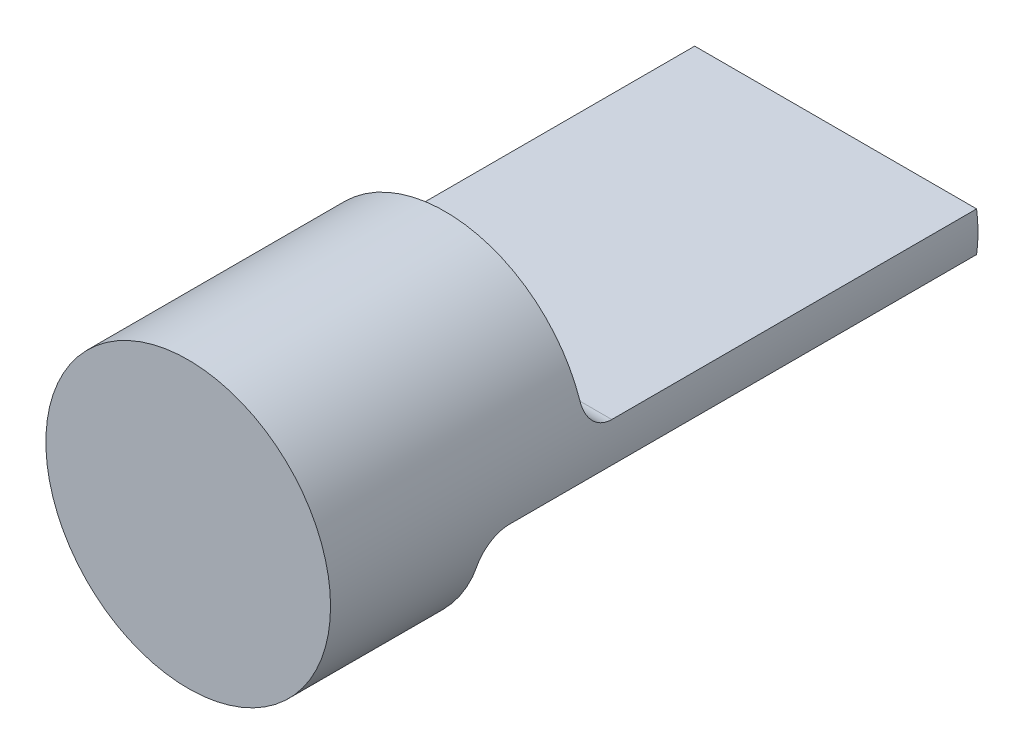
ISO-10303-21;
HEADER;
FILE_DESCRIPTION(('STEP AP214'),'2;1');
FILE_NAME('part.step','',(''),(''),'','','');
FILE_SCHEMA(('AUTOMOTIVE_DESIGN { 1 0 10303 214 1 1 1 1 }'));
ENDSEC;
DATA;
#1=APPLICATION_CONTEXT('core data for automotive mechanical design processes');
#2=APPLICATION_PROTOCOL_DEFINITION('international standard','automotive_design',2000,#1);
#3=PRODUCT_CONTEXT('',#1,'mechanical');
#4=PRODUCT('Part','Part','',(#3));
#5=PRODUCT_RELATED_PRODUCT_CATEGORY('part','',(#4));
#6=PRODUCT_DEFINITION_FORMATION('','',#4);
#7=PRODUCT_DEFINITION_CONTEXT('part definition',#1,'design');
#8=PRODUCT_DEFINITION('design','',#6,#7);
#9=PRODUCT_DEFINITION_SHAPE('','',#8);
#10=(LENGTH_UNIT() NAMED_UNIT(*) SI_UNIT(.MILLI.,.METRE.));
#11=(NAMED_UNIT(*) PLANE_ANGLE_UNIT() SI_UNIT($,.RADIAN.));
#12=(NAMED_UNIT(*) SI_UNIT($,.STERADIAN.) SOLID_ANGLE_UNIT());
#13=UNCERTAINTY_MEASURE_WITH_UNIT(LENGTH_MEASURE(1.E-05),#10,'distance_accuracy_value','');
#14=(GEOMETRIC_REPRESENTATION_CONTEXT(3) GLOBAL_UNCERTAINTY_ASSIGNED_CONTEXT((#13)) GLOBAL_UNIT_ASSIGNED_CONTEXT((#10,
#11,#12)) REPRESENTATION_CONTEXT('',''));
#15=CARTESIAN_POINT('',(0.,0.,0.));
#16=DIRECTION('',(0.,0.,1.));
#17=DIRECTION('',(1.,0.,0.));
#18=AXIS2_PLACEMENT_3D('',#15,#16,#17);
#19=CARTESIAN_POINT('',(0.,0.,63.));
#20=DIRECTION('',(0.,0.,-1.));
#21=DIRECTION('',(-1.,0.,0.));
#22=AXIS2_PLACEMENT_3D('',#19,#20,#21);
#23=CYLINDRICAL_SURFACE('',#22,13.85);
#24=CARTESIAN_POINT('',(0.,0.,63.));
#25=DIRECTION('',(0.,0.,1.));
#26=DIRECTION('',(1.,0.,0.));
#27=AXIS2_PLACEMENT_3D('',#24,#25,#26);
#28=CIRCLE('',#27,13.85);
#29=CARTESIAN_POINT('',(13.85,0.,63.));
#30=VERTEX_POINT('',#29);
#31=EDGE_CURVE('E126',#30,#30,#28,.T.);
#32=ORIENTED_EDGE('',*,*,#31,.F.);
#33=EDGE_LOOP('',(#32));
#34=FACE_BOUND('',#33,.T.);
#35=CARTESIAN_POINT('',(0.,0.,0.));
#36=DIRECTION('',(0.,0.,1.));
#37=DIRECTION('',(1.,0.,0.));
#38=AXIS2_PLACEMENT_3D('',#35,#36,#37);
#39=CIRCLE('',#38,13.85);
#40=CARTESIAN_POINT('',(13.7155705313341,-1.925,0.));
#41=VERTEX_POINT('',#40);
#42=CARTESIAN_POINT('',(13.7155705313341,1.925,0.));
#43=VERTEX_POINT('',#42);
#44=EDGE_CURVE('E125',#41,#43,#39,.T.);
#45=ORIENTED_EDGE('',*,*,#44,.T.);
#46=DIRECTION('',(0.,0.,-1.));
#47=VECTOR('',#46,1.);
#48=CARTESIAN_POINT('',(13.7155705313341,1.92499999999999,63.));
#49=LINE('',#48,#47);
#50=CARTESIAN_POINT('',(13.7155705313341,1.925,35.5));
#51=VERTEX_POINT('',#50);
#52=EDGE_CURVE('E62',#43,#51,#49,.F.);
#53=ORIENTED_EDGE('',*,*,#52,.T.);
#54=CARTESIAN_POINT('',(13.1240952069086,4.425,33.));
#55=CARTESIAN_POINT('',(13.1710729115553,4.285664156442,33.0000033032158));
#56=CARTESIAN_POINT('',(13.2158293360581,4.14552989343168,33.0116741758177));
#57=CARTESIAN_POINT('',(13.2998292439436,3.86757500273158,33.0588627106092));
#58=CARTESIAN_POINT('',(13.3390713291011,3.72975496961395,33.0943864078145));
#59=CARTESIAN_POINT('',(13.4114541945794,3.46047342005468,33.1891362792788));
#60=CARTESIAN_POINT('',(13.4445834953402,3.32902420216501,33.2484063997825));
#61=CARTESIAN_POINT('',(13.5044426577589,3.07722192265797,33.3894763389114));
#62=CARTESIAN_POINT('',(13.5311736489143,2.95686690488472,33.4712721755674));
#63=CARTESIAN_POINT('',(13.5776448323384,2.73540628678558,33.6520299428437));
#64=CARTESIAN_POINT('',(13.5975955312249,2.63377741145651,33.7502972203497));
#65=CARTESIAN_POINT('',(13.6322362885744,2.4481768476607,33.9630888236747));
#66=CARTESIAN_POINT('',(13.6469268359273,2.36420351854861,34.0776116372863));
#67=CARTESIAN_POINT('',(13.6714254158534,2.21811373917011,34.3172220824305));
#68=CARTESIAN_POINT('',(13.6813226789287,2.15560470297203,34.4420615201681));
#69=CARTESIAN_POINT('',(13.6972219139048,2.05216145062878,34.7006111216565));
#70=CARTESIAN_POINT('',(13.7032239816441,2.01122670366859,34.8343210670656));
#71=CARTESIAN_POINT('',(13.7117493874094,1.95226104461971,35.1064347973562));
#72=CARTESIAN_POINT('',(13.7142818248906,1.93417023182164,35.2448253252442));
#73=CARTESIAN_POINT('',(13.7160998313416,1.92123664939352,35.5227105317452));
#74=CARTESIAN_POINT('',(13.7153853864278,1.92639397917244,35.6622052150769));
#75=CARTESIAN_POINT('',(13.7106493418299,1.95981485166587,35.9384421341922));
#76=CARTESIAN_POINT('',(13.7066254051514,1.98809472225718,36.0751823549891));
#77=CARTESIAN_POINT('',(13.6949584801241,2.06692693062219,36.3419212582562));
#78=CARTESIAN_POINT('',(13.687315535298,2.11747900054688,36.4719200217793));
#79=CARTESIAN_POINT('',(13.6679155960134,2.23927779444663,36.72142571145));
#80=CARTESIAN_POINT('',(13.6561604555842,2.3105151897553,36.8409373355186));
#81=CARTESIAN_POINT('',(13.6279496469324,2.47146514725827,37.0661601897863));
#82=CARTESIAN_POINT('',(13.6114941549171,2.56117701684398,37.1718719371004));
#83=CARTESIAN_POINT('',(13.5733334764482,2.75626096010474,37.366631355932));
#84=CARTESIAN_POINT('',(13.5516267202655,2.86163771275222,37.4556740305185));
#85=CARTESIAN_POINT('',(13.5026028756308,3.08467719568579,37.614782072838));
#86=CARTESIAN_POINT('',(13.4752857488211,3.20234000996846,37.6848473108154));
#87=CARTESIAN_POINT('',(13.4146390422642,3.44761834831163,37.8051213934258));
#88=CARTESIAN_POINT('',(13.3812475051674,3.57532792315746,37.8551067921606));
#89=CARTESIAN_POINT('',(13.3089442370133,3.83572225675879,37.9333609606225));
#90=CARTESIAN_POINT('',(13.2700316919723,3.96840774700705,37.9616265241596));
#91=CARTESIAN_POINT('',(13.18588896636,4.23977630041225,37.9970118631079));
#92=CARTESIAN_POINT('',(13.1404848194382,4.37850626206434,38.0033535783124));
#93=CARTESIAN_POINT('',(13.045562795511,4.65370887718902,37.9933250838909));
#94=CARTESIAN_POINT('',(12.9960437747348,4.79018089031693,37.9769485395102));
#95=CARTESIAN_POINT('',(12.8913536288332,5.06541259775386,37.920892208483));
#96=CARTESIAN_POINT('',(12.8360212526374,5.20384762145553,37.8799186714713));
#97=CARTESIAN_POINT('',(12.7243116111879,5.47132843863055,37.7750498958281));
#98=CARTESIAN_POINT('',(12.6679339547631,5.60037062429042,37.7111459048519));
#99=CARTESIAN_POINT('',(12.5538891218842,5.85168939067569,37.558435702347));
#100=CARTESIAN_POINT('',(12.496281790263,5.97338233348139,37.4686198560147));
#101=CARTESIAN_POINT('',(12.3855341740798,6.19975343073754,37.2672560377124));
#102=CARTESIAN_POINT('',(12.3323945254696,6.3044291648488,37.1557049793185));
#103=CARTESIAN_POINT('',(12.2354217962344,6.4905857840395,36.9162444394477));
#104=CARTESIAN_POINT('',(12.1913829501092,6.57259820707086,36.7888347281016));
#105=CARTESIAN_POINT('',(12.1145667694054,6.71313881281902,36.5185961464812));
#106=CARTESIAN_POINT('',(12.0817763868004,6.7716942186016,36.3757853957419));
#107=CARTESIAN_POINT('',(12.0337429305439,6.85664975661643,36.0965410836403));
#108=CARTESIAN_POINT('',(12.016911168809,6.88598156924226,35.9612745032272));
#109=CARTESIAN_POINT('',(11.9962951775972,6.92183943602916,35.6868080132742));
#110=CARTESIAN_POINT('',(11.9925003886362,6.92838394715172,35.5476113791254));
#111=CARTESIAN_POINT('',(11.9980035659137,6.91884422581791,35.2852836697735));
#112=CARTESIAN_POINT('',(12.0059424021261,6.90510919602646,35.1620290903107));
#113=CARTESIAN_POINT('',(12.0318371835249,6.8598881760118,34.9199290625914));
#114=CARTESIAN_POINT('',(12.0497935424992,6.82840145252898,34.801083796684));
#115=CARTESIAN_POINT('',(12.0945255881311,6.74885355528383,34.5700943176525));
#116=CARTESIAN_POINT('',(12.1213521169147,6.7006967553563,34.4579932446777));
#117=CARTESIAN_POINT('',(12.1820784646159,6.58964793425681,34.2434552449521));
#118=CARTESIAN_POINT('',(12.215980449555,6.52675140005874,34.1410212915904));
#119=CARTESIAN_POINT('',(12.2928190920336,6.38095195693347,33.9374735603376));
#120=CARTESIAN_POINT('',(12.3363257271191,6.29665883839376,33.8375724367558));
#121=CARTESIAN_POINT('',(12.4275054100178,6.11473380784484,33.6529429224802));
#122=CARTESIAN_POINT('',(12.4751811799278,6.01709315722753,33.5682245565902));
#123=CARTESIAN_POINT('',(12.5783571259582,5.79859092470527,33.4062392386173));
#124=CARTESIAN_POINT('',(12.634120958907,5.67634919669665,33.3309969572025));
#125=CARTESIAN_POINT('',(12.7458005624646,5.42092900940774,33.2024897862467));
#126=CARTESIAN_POINT('',(12.8017162813143,5.28775391085973,33.1492181733987));
#127=CARTESIAN_POINT('',(12.9033849113065,5.0339827368016,33.0722417685126));
#128=CARTESIAN_POINT('',(12.9494117513381,4.91446460319946,33.0453164309181));
#129=CARTESIAN_POINT('',(13.0389078106179,4.67184054255879,33.0091952480748));
#130=CARTESIAN_POINT('',(13.0823773661491,4.54873509045078,32.9999970666291));
#131=CARTESIAN_POINT('',(13.1240952069086,4.425,33.));
#132=B_SPLINE_CURVE_WITH_KNOTS('',3,(#54,#55,#56,#57,#58,#59,#60,#61,#62,#63,#64,#65,#66,#67,
#68,#69,#70,#71,#72,#73,#74,#75,#76,#77,#78,#79,#80,#81,#82,#83,#84,#85,#86,#87,#88,#89,#90,#91,
#92,#93,#94,#95,#96,#97,#98,#99,#100,#101,#102,#103,#104,#105,#106,#107,#108,#109,#110,#111,
#112,#113,#114,#115,#116,#117,#118,#119,#120,#121,#122,#123,#124,#125,#126,#127,#128,#129,#130,
#131),.UNSPECIFIED.,.T.,.F.,(4,2,2,2,2,2,2,2,2,2,2,2,2,2,2,2,2,2,2,2,2,2,2,2,2,2,2,2,2,2,2,2,2,
2,2,2,2,2,4),(0.,0.440693399772733,0.881498341649641,1.32312285409781,1.76466934870905,
2.19088451376343,2.61706005516202,3.03496397145971,3.45285760514603,3.86965315908836,
4.28645049524864,4.70354240539619,5.120629299667,5.53752838748723,5.95441184859276,
6.37142008050834,6.78843116358655,7.20996205249228,7.63155515405194,8.06796475656859,
8.50449607190934,8.9662901834331,9.42826074537023,9.91146625491644,10.3947404302468,
10.8654703614668,11.3356523927869,11.751556408578,12.1671234773917,12.5381689734706,
12.909229797248,13.2824554468891,13.6557955207678,14.0674220102639,14.4793192932896,
14.9393049658758,15.3991497723038,15.7905524719736,16.1819035865864),.UNSPECIFIED.);
#133=CARTESIAN_POINT('',(13.1240952069086,4.425,38.));
#134=VERTEX_POINT('',#133);
#135=EDGE_CURVE('E11',#51,#134,#132,.T.);
#136=ORIENTED_EDGE('',*,*,#135,.T.);
#137=CARTESIAN_POINT('',(0.,0.,38.));
#138=DIRECTION('',(0.,0.,1.));
#139=DIRECTION('',(0.,-1.,0.));
#140=AXIS2_PLACEMENT_3D('',#137,#138,#139);
#141=CIRCLE('',#140,13.85);
#142=CARTESIAN_POINT('',(-13.1240952069086,4.425,38.));
#143=VERTEX_POINT('',#142);
#144=EDGE_CURVE('E151',#134,#143,#141,.T.);
#145=ORIENTED_EDGE('',*,*,#144,.T.);
#146=CARTESIAN_POINT('',(-13.1240952069086,4.425,33.));
#147=CARTESIAN_POINT('',(-13.0733479766338,4.57549812161907,33.0000062050174));
#148=CARTESIAN_POINT('',(-13.0199532867486,4.72522899643394,33.0136289802837));
#149=CARTESIAN_POINT('',(-12.9096466213274,5.01878706047528,33.066946715189));
#150=CARTESIAN_POINT('',(-12.8527290392488,5.1626041997489,33.1066842548812));
#151=CARTESIAN_POINT('',(-12.7376911590583,5.44024419907669,33.2106324766801));
#152=CARTESIAN_POINT('',(-12.6795732597611,5.5740849155522,33.274798113687));
#153=CARTESIAN_POINT('',(-12.5645514152182,5.82872918467623,33.425999615065));
#154=CARTESIAN_POINT('',(-12.5076473663943,5.94953385329476,33.51303351957));
#155=CARTESIAN_POINT('',(-12.3970895030042,6.17663972084805,33.7098390259296));
#156=CARTESIAN_POINT('',(-12.3435006038268,6.2826839452063,33.819945602102));
#157=CARTESIAN_POINT('',(-12.2441064716436,6.47425841130015,34.0598298179391));
#158=CARTESIAN_POINT('',(-12.1982983273594,6.55979633070729,34.1896000656255));
#159=CARTESIAN_POINT('',(-12.1212283065066,6.7010728756814,34.455751193342));
#160=CARTESIAN_POINT('',(-12.0891527835583,6.75852194746841,34.5909712732687));
#161=CARTESIAN_POINT('',(-12.0508134592307,6.82649677076169,34.8012422055829));
#162=CARTESIAN_POINT('',(-12.039662580648,6.84612207772249,34.8725738159095));
#163=CARTESIAN_POINT('',(-12.0208823683343,6.87904374136485,35.0171297207543));
#164=CARTESIAN_POINT('',(-12.0132525096906,6.89234104143331,35.090353731434));
#165=CARTESIAN_POINT('',(-11.9974943040335,6.91976083579523,35.2927580833541));
#166=CARTESIAN_POINT('',(-11.9931791110817,6.92720551621889,35.4232295766942));
#167=CARTESIAN_POINT('',(-11.9963822130264,6.92165535691941,35.6834941786369));
#168=CARTESIAN_POINT('',(-12.0038969734664,6.90866662212525,35.8132874782412));
#169=CARTESIAN_POINT('',(-12.0292524956109,6.86441336124293,36.060408152969));
#170=CARTESIAN_POINT('',(-12.0464385401937,6.83430645790052,36.1780139170247));
#171=CARTESIAN_POINT('',(-12.0893687386996,6.75807401821154,36.4062295694111));
#172=CARTESIAN_POINT('',(-12.1151144757515,6.71194551857416,36.5168381590954));
#173=CARTESIAN_POINT('',(-12.1752991383042,6.60217546491144,36.7351995916917));
#174=CARTESIAN_POINT('',(-12.210164192911,6.53765512491626,36.8423908481403));
#175=CARTESIAN_POINT('',(-12.2856868370472,6.39460230816353,37.044679339107));
#176=CARTESIAN_POINT('',(-12.3263470155209,6.31606356477179,37.1397711321144));
#177=CARTESIAN_POINT('',(-12.4166756150152,6.13676563560632,37.3271924899892));
#178=CARTESIAN_POINT('',(-12.4668393297425,6.03447012223425,37.4178149056539));
#179=CARTESIAN_POINT('',(-12.5696269330984,5.81733805551668,37.5808283244643));
#180=CARTESIAN_POINT('',(-12.6222520448595,5.70249522839069,37.6532101467744));
#181=CARTESIAN_POINT('',(-12.7328139469085,5.45146249241622,37.7843497442137));
#182=CARTESIAN_POINT('',(-12.7907855059896,5.31428068549191,37.8411900682264));
#183=CARTESIAN_POINT('',(-12.9047377142093,5.031253928026,37.9299079418506));
#184=CARTESIAN_POINT('',(-12.9607180677156,4.88540769959932,37.9617817993631));
#185=CARTESIAN_POINT('',(-13.0692685377685,4.58717378608069,37.9993062784348));
#186=CARTESIAN_POINT('',(-13.1217925438567,4.43473051101787,38.004654051155));
#187=CARTESIAN_POINT('',(-13.2210083864587,4.12954640899207,37.9871755073149));
#188=CARTESIAN_POINT('',(-13.2677021921058,3.97680570028423,37.9643587317478));
#189=CARTESIAN_POINT('',(-13.3518270960509,3.68418143467437,37.8922155411619));
#190=CARTESIAN_POINT('',(-13.3896151856491,3.54404343395187,37.8443397924601));
#191=CARTESIAN_POINT('',(-13.4584128659138,3.27309597780316,37.7237536659717));
#192=CARTESIAN_POINT('',(-13.4894247647083,3.14228335619731,37.651051766242));
#193=CARTESIAN_POINT('',(-13.5431518923448,2.9017090136925,37.4873524229196));
#194=CARTESIAN_POINT('',(-13.5662330143285,2.79118062558073,37.3975995039043));
#195=CARTESIAN_POINT('',(-13.6067483838607,2.58646588159658,37.2000054249475));
#196=CARTESIAN_POINT('',(-13.6241835086628,2.49227698801243,37.0921670790072));
#197=CARTESIAN_POINT('',(-13.6535956923298,2.32568581589103,36.8646369691521));
#198=CARTESIAN_POINT('',(-13.6657061007544,2.2527688014382,36.7453387571788));
#199=CARTESIAN_POINT('',(-13.6857340039593,2.12772480361476,36.4959806278589));
#200=CARTESIAN_POINT('',(-13.6936516615171,2.07559701315259,36.3659211285302));
#201=CARTESIAN_POINT('',(-13.7057766384097,1.99396423440986,36.0994818369093));
#202=CARTESIAN_POINT('',(-13.7100033658982,1.96434101788269,35.9631391228793));
#203=CARTESIAN_POINT('',(-13.7151397276241,1.92815513839212,35.6873650196513));
#204=CARTESIAN_POINT('',(-13.7160493488457,1.9215925659154,35.5479336183359));
#205=CARTESIAN_POINT('',(-13.7146253486624,1.93172881149416,35.2698501643993));
#206=CARTESIAN_POINT('',(-13.7122897486392,1.94844182073626,35.1311986390343));
#207=CARTESIAN_POINT('',(-13.7041842938742,2.00465204358885,34.8586972582125));
#208=CARTESIAN_POINT('',(-13.6984144505094,2.04414918172051,34.7248473868503));
#209=CARTESIAN_POINT('',(-13.6830273779449,2.14472219348599,34.4657659923688));
#210=CARTESIAN_POINT('',(-13.6734105091754,2.20579604552183,34.3405336631547));
#211=CARTESIAN_POINT('',(-13.6497723675692,2.34762876704786,34.1022331329705));
#212=CARTESIAN_POINT('',(-13.6357513852843,2.42838633786928,33.9891641302122));
#213=CARTESIAN_POINT('',(-13.6027313457195,2.60699433696523,33.7783941596791));
#214=CARTESIAN_POINT('',(-13.5837349361956,2.7048356646319,33.6806850620007));
#215=CARTESIAN_POINT('',(-13.540286106782,2.91454886217578,33.5031488429918));
#216=CARTESIAN_POINT('',(-13.5158326905055,3.02642329270093,33.4233249926431));
#217=CARTESIAN_POINT('',(-13.4610486642115,3.26149154174971,33.2829911952921));
#218=CARTESIAN_POINT('',(-13.4306770498133,3.38476098341818,33.2226242844379));
#219=CARTESIAN_POINT('',(-13.3642840479728,3.63806322497443,33.1231917206225));
#220=CARTESIAN_POINT('',(-13.3282674453285,3.76809023519256,33.0841081519057));
#221=CARTESIAN_POINT('',(-13.2641849068456,3.98649515268673,33.0371493214295));
#222=CARTESIAN_POINT('',(-13.2375644131966,4.07404459975529,33.0231854938334));
#223=CARTESIAN_POINT('',(-13.1822935089462,4.24948273988841,33.0046091063227));
#224=CARTESIAN_POINT('',(-13.1536431329381,4.33737142714751,32.9999963870857));
#225=CARTESIAN_POINT('',(-13.1240952069086,4.425,33.));
#226=B_SPLINE_CURVE_WITH_KNOTS('',3,(#146,#147,#148,#149,#150,#151,#152,#153,#154,#155,#156,
#157,#158,#159,#160,#161,#162,#163,#164,#165,#166,#167,#168,#169,#170,#171,#172,#173,#174,#175,
#176,#177,#178,#179,#180,#181,#182,#183,#184,#185,#186,#187,#188,#189,#190,#191,#192,#193,#194,
#195,#196,#197,#198,#199,#200,#201,#202,#203,#204,#205,#206,#207,#208,#209,#210,#211,#212,#213,
#214,#215,#216,#217,#218,#219,#220,#221,#222,#223,#224,#225),.UNSPECIFIED.,.T.,.F.,(4,2,2,2,2,2,
2,2,2,2,2,2,2,2,2,2,2,2,2,2,2,2,2,2,2,2,2,2,2,2,2,2,2,2,2,2,2,2,2,4),(0.,0.476120805701966,
0.953019857613293,1.42904374013494,1.90502683955103,2.38846968074073,2.87173123463798,
3.31996726687813,3.54409223600516,3.7681837818356,4.15818453596605,4.54806879098301,
4.91427871840489,5.28055641466098,5.66862963391065,6.0568767696551,6.49180998727344,
6.92696167974281,7.40297327450077,7.87905524967322,8.3605603482859,8.8419023774843,
9.29804020847584,9.75402242527268,10.184608058811,10.61512675745,11.0341459919133,
11.4531489573802,11.8699351622817,12.2867230025912,12.7037650708821,13.1208057576118,
13.537807380695,13.9547814987893,14.3715341664874,14.7883629907923,15.2081896821747,
15.6276624260906,15.9048917836846,16.1821164178541),.UNSPECIFIED.);
#227=CARTESIAN_POINT('',(-13.7155705313341,1.925,35.5));
#228=VERTEX_POINT('',#227);
#229=EDGE_CURVE('E47',#143,#228,#226,.T.);
#230=ORIENTED_EDGE('',*,*,#229,.T.);
#231=DIRECTION('',(0.,0.,-1.));
#232=VECTOR('',#231,1.);
#233=CARTESIAN_POINT('',(-13.7155705313341,1.92499999999999,63.));
#234=LINE('',#233,#232);
#235=CARTESIAN_POINT('',(-13.7155705313341,1.925,0.));
#236=VERTEX_POINT('',#235);
#237=EDGE_CURVE('E123',#228,#236,#234,.T.);
#238=ORIENTED_EDGE('',*,*,#237,.T.);
#239=CARTESIAN_POINT('',(-13.7155705313341,-1.925,0.));
#240=VERTEX_POINT('',#239);
#241=EDGE_CURVE('E114',#236,#240,#39,.T.);
#242=ORIENTED_EDGE('',*,*,#241,.T.);
#243=DIRECTION('',(0.,0.,-1.));
#244=VECTOR('',#243,1.);
#245=CARTESIAN_POINT('',(-13.7155705313341,-1.92500000000002,63.));
#246=LINE('',#245,#244);
#247=CARTESIAN_POINT('',(-13.7155705313341,-1.92500000000001,45.5));
#248=VERTEX_POINT('',#247);
#249=EDGE_CURVE('E54',#240,#248,#246,.F.);
#250=ORIENTED_EDGE('',*,*,#249,.T.);
#251=CARTESIAN_POINT('',(-13.1240952069085,-4.42500000000001,43.));
#252=CARTESIAN_POINT('',(-13.1710729115553,-4.28566415644201,43.0000033032158));
#253=CARTESIAN_POINT('',(-13.215829336058,-4.1455298934317,43.0116741758177));
#254=CARTESIAN_POINT('',(-13.2998292439436,-3.8675750027316,43.0588627106092));
#255=CARTESIAN_POINT('',(-13.3390713291011,-3.72975496961397,43.0943864078145));
#256=CARTESIAN_POINT('',(-13.4114541945794,-3.4604734200547,43.1891362792788));
#257=CARTESIAN_POINT('',(-13.4445834953402,-3.32902420216503,43.2484063997825));
#258=CARTESIAN_POINT('',(-13.5044426577589,-3.07722192265799,43.3894763389114));
#259=CARTESIAN_POINT('',(-13.5311736489142,-2.95686690488474,43.4712721755674));
#260=CARTESIAN_POINT('',(-13.5776448323384,-2.7354062867856,43.6520299428437));
#261=CARTESIAN_POINT('',(-13.5975955312249,-2.63377741145653,43.7502972203498));
#262=CARTESIAN_POINT('',(-13.6322362885744,-2.44817684766071,43.9630888236747));
#263=CARTESIAN_POINT('',(-13.6469268359273,-2.36420351854863,44.0776116372863));
#264=CARTESIAN_POINT('',(-13.6714254158534,-2.21811373917013,44.3172220824305));
#265=CARTESIAN_POINT('',(-13.6813226789287,-2.15560470297204,44.4420615201682));
#266=CARTESIAN_POINT('',(-13.6972219139048,-2.05216145062879,44.7006111216565));
#267=CARTESIAN_POINT('',(-13.7032239816441,-2.0112267036686,44.8343210670656));
#268=CARTESIAN_POINT('',(-13.7117493874094,-1.95226104461973,45.1064347973562));
#269=CARTESIAN_POINT('',(-13.7142818248906,-1.93417023182166,45.2448253252442));
#270=CARTESIAN_POINT('',(-13.7160998313416,-1.92123664939354,45.5227105317452));
#271=CARTESIAN_POINT('',(-13.7153853864278,-1.92639397917246,45.6622052150769));
#272=CARTESIAN_POINT('',(-13.7106493418299,-1.95981485166588,45.9384421341922));
#273=CARTESIAN_POINT('',(-13.7066254051514,-1.9880947222572,46.0751823549891));
#274=CARTESIAN_POINT('',(-13.6949584801241,-2.06692693062221,46.3419212582562));
#275=CARTESIAN_POINT('',(-13.687315535298,-2.1174790005469,46.4719200217793));
#276=CARTESIAN_POINT('',(-13.6679155960134,-2.23927779444665,46.72142571145));
#277=CARTESIAN_POINT('',(-13.6561604555842,-2.31051518975531,46.8409373355186));
#278=CARTESIAN_POINT('',(-13.6279496469324,-2.47146514725828,47.0661601897863));
#279=CARTESIAN_POINT('',(-13.6114941549171,-2.561177016844,47.1718719371004));
#280=CARTESIAN_POINT('',(-13.5733334764482,-2.75626096010476,47.366631355932));
#281=CARTESIAN_POINT('',(-13.5516267202655,-2.86163771275224,47.4556740305185));
#282=CARTESIAN_POINT('',(-13.5026028756308,-3.08467719568581,47.614782072838));
#283=CARTESIAN_POINT('',(-13.4752857488211,-3.20234000996848,47.6848473108154));
#284=CARTESIAN_POINT('',(-13.4146390422642,-3.44761834831164,47.8051213934258));
#285=CARTESIAN_POINT('',(-13.3812475051674,-3.57532792315748,47.8551067921606));
#286=CARTESIAN_POINT('',(-13.3089442370133,-3.83572225675881,47.9333609606225));
#287=CARTESIAN_POINT('',(-13.2700316919723,-3.96840774700706,47.9616265241596));
#288=CARTESIAN_POINT('',(-13.1858889663599,-4.23977630041227,47.9970118631079));
#289=CARTESIAN_POINT('',(-13.1404848194382,-4.37850626206435,48.0033535783124));
#290=CARTESIAN_POINT('',(-13.045562795511,-4.65370887718904,47.9933250838909));
#291=CARTESIAN_POINT('',(-12.9960437747348,-4.79018089031695,47.9769485395102));
#292=CARTESIAN_POINT('',(-12.8913536288332,-5.06541259775388,47.920892208483));
#293=CARTESIAN_POINT('',(-12.8360212526374,-5.20384762145554,47.8799186714713));
#294=CARTESIAN_POINT('',(-12.7243116111879,-5.47132843863056,47.7750498958281));
#295=CARTESIAN_POINT('',(-12.6679339547631,-5.60037062429043,47.7111459048519));
#296=CARTESIAN_POINT('',(-12.5538891218842,-5.8516893906757,47.558435702347));
#297=CARTESIAN_POINT('',(-12.496281790263,-5.9733823334814,47.4686198560147));
#298=CARTESIAN_POINT('',(-12.3855341740798,-6.19975343073755,47.2672560377124));
#299=CARTESIAN_POINT('',(-12.3323945254696,-6.30442916484881,47.1557049793185));
#300=CARTESIAN_POINT('',(-12.2354217962344,-6.49058578403951,46.9162444394477));
#301=CARTESIAN_POINT('',(-12.1913829501091,-6.57259820707087,46.7888347281016));
#302=CARTESIAN_POINT('',(-12.1145667694054,-6.71313881281903,46.5185961464812));
#303=CARTESIAN_POINT('',(-12.0817763868004,-6.77169421860162,46.3757853957419));
#304=CARTESIAN_POINT('',(-12.0337429305439,-6.85664975661644,46.0965410836402));
#305=CARTESIAN_POINT('',(-12.016911168809,-6.88598156924227,45.9612745032272));
#306=CARTESIAN_POINT('',(-11.9962951775972,-6.92183943602918,45.6868080132742));
#307=CARTESIAN_POINT('',(-11.9925003886362,-6.92838394715173,45.5476113791254));
#308=CARTESIAN_POINT('',(-11.9980035659136,-6.91884422581792,45.2852836697734));
#309=CARTESIAN_POINT('',(-12.0059424021261,-6.90510919602647,45.1620290903107));
#310=CARTESIAN_POINT('',(-12.0318371835249,-6.85988817601181,44.9199290625914));
#311=CARTESIAN_POINT('',(-12.0497935424992,-6.82840145252899,44.801083796684));
#312=CARTESIAN_POINT('',(-12.094525588131,-6.74885355528384,44.5700943176525));
#313=CARTESIAN_POINT('',(-12.1213521169146,-6.70069675535631,44.4579932446777));
#314=CARTESIAN_POINT('',(-12.1820784646159,-6.58964793425682,44.2434552449521));
#315=CARTESIAN_POINT('',(-12.215980449555,-6.52675140005876,44.1410212915904));
#316=CARTESIAN_POINT('',(-12.2928190920336,-6.38095195693348,43.9374735603376));
#317=CARTESIAN_POINT('',(-12.3363257271191,-6.29665883839377,43.8375724367558));
#318=CARTESIAN_POINT('',(-12.4275054100178,-6.11473380784486,43.6529429224802));
#319=CARTESIAN_POINT('',(-12.4751811799277,-6.01709315722755,43.5682245565902));
#320=CARTESIAN_POINT('',(-12.5783571259581,-5.79859092470528,43.4062392386173));
#321=CARTESIAN_POINT('',(-12.634120958907,-5.67634919669665,43.3309969572025));
#322=CARTESIAN_POINT('',(-12.7458005624646,-5.42092900940775,43.2024897862467));
#323=CARTESIAN_POINT('',(-12.8017162813143,-5.28775391085975,43.1492181733987));
#324=CARTESIAN_POINT('',(-12.9033849113065,-5.03398273680162,43.0722417685126));
#325=CARTESIAN_POINT('',(-12.9494117513381,-4.91446460319948,43.0453164309181));
#326=CARTESIAN_POINT('',(-13.0389078106179,-4.6718405425588,43.0091952480748));
#327=CARTESIAN_POINT('',(-13.0823773661491,-4.5487350904508,42.9999970666291));
#328=CARTESIAN_POINT('',(-13.1240952069085,-4.42500000000001,43.));
#329=B_SPLINE_CURVE_WITH_KNOTS('',3,(#251,#252,#253,#254,#255,#256,#257,#258,#259,#260,#261,
#262,#263,#264,#265,#266,#267,#268,#269,#270,#271,#272,#273,#274,#275,#276,#277,#278,#279,#280,
#281,#282,#283,#284,#285,#286,#287,#288,#289,#290,#291,#292,#293,#294,#295,#296,#297,#298,#299,
#300,#301,#302,#303,#304,#305,#306,#307,#308,#309,#310,#311,#312,#313,#314,#315,#316,#317,#318,
#319,#320,#321,#322,#323,#324,#325,#326,#327,#328),.UNSPECIFIED.,.T.,.F.,(4,2,2,2,2,2,2,2,2,2,2,
2,2,2,2,2,2,2,2,2,2,2,2,2,2,2,2,2,2,2,2,2,2,2,2,2,2,2,4),(0.,0.440693399772732,
0.881498341649639,1.3231228540978,1.76466934870904,2.19088451376343,2.61706005516202,
3.03496397145972,3.45285760514603,3.86965315908836,4.28645049524864,4.70354240539618,
5.12062929966699,5.53752838748721,5.95441184859275,6.37142008050833,6.78843116358654,
7.20996205249227,7.63155515405192,8.06796475656857,8.50449607190932,8.96629018343308,
9.42826074537021,9.91146625491642,10.3947404302468,10.8654703614668,11.3356523927869,
11.751556408578,12.1671234773917,12.5381689734705,12.909229797248,13.2824554468891,
13.6557955207678,14.0674220102639,14.4793192932896,14.9393049658758,15.3991497723038,
15.7905524719735,16.1819035865864),.UNSPECIFIED.);
#330=CARTESIAN_POINT('',(-13.1240952069085,-4.42500000000001,48.));
#331=VERTEX_POINT('',#330);
#332=EDGE_CURVE('E95',#248,#331,#329,.T.);
#333=ORIENTED_EDGE('',*,*,#332,.T.);
#334=CARTESIAN_POINT('',(0.,0.,48.));
#335=DIRECTION('',(0.,0.,1.));
#336=DIRECTION('',(1.,0.,0.));
#337=AXIS2_PLACEMENT_3D('',#334,#335,#336);
#338=CIRCLE('',#337,13.85);
#339=CARTESIAN_POINT('',(13.1240952069085,-4.42500000000001,48.));
#340=VERTEX_POINT('',#339);
#341=EDGE_CURVE('E103',#331,#340,#338,.T.);
#342=ORIENTED_EDGE('',*,*,#341,.T.);
#343=CARTESIAN_POINT('',(13.1240952069085,-4.42500000000001,43.));
#344=CARTESIAN_POINT('',(13.0733479766338,-4.57549812161909,43.0000062050174));
#345=CARTESIAN_POINT('',(13.0199532867486,-4.72522899643395,43.0136289802837));
#346=CARTESIAN_POINT('',(12.9096466213274,-5.01878706047529,43.066946715189));
#347=CARTESIAN_POINT('',(12.8527290392488,-5.16260419974891,43.1066842548812));
#348=CARTESIAN_POINT('',(12.7376911590583,-5.4402441990767,43.2106324766801));
#349=CARTESIAN_POINT('',(12.6795732597611,-5.57408491555221,43.274798113687));
#350=CARTESIAN_POINT('',(12.5645514152182,-5.82872918467624,43.425999615065));
#351=CARTESIAN_POINT('',(12.5076473663943,-5.94953385329476,43.51303351957));
#352=CARTESIAN_POINT('',(12.3970895030042,-6.17663972084806,43.7098390259296));
#353=CARTESIAN_POINT('',(12.3435006038268,-6.2826839452063,43.819945602102));
#354=CARTESIAN_POINT('',(12.2441064716436,-6.47425841130016,44.0598298179391));
#355=CARTESIAN_POINT('',(12.1982983273594,-6.5597963307073,44.1896000656255));
#356=CARTESIAN_POINT('',(12.1212283065066,-6.70107287568141,44.455751193342));
#357=CARTESIAN_POINT('',(12.0891527835583,-6.75852194746842,44.5909712732687));
#358=CARTESIAN_POINT('',(12.0508134592307,-6.8264967707617,44.8012422055829));
#359=CARTESIAN_POINT('',(12.039662580648,-6.84612207772251,44.8725738159095));
#360=CARTESIAN_POINT('',(12.0208823683343,-6.87904374136486,45.0171297207543));
#361=CARTESIAN_POINT('',(12.0132525096906,-6.89234104143333,45.090353731434));
#362=CARTESIAN_POINT('',(11.9974943040335,-6.91976083579525,45.2927580833541));
#363=CARTESIAN_POINT('',(11.9931791110817,-6.9272055162189,45.4232295766942));
#364=CARTESIAN_POINT('',(11.9963822130264,-6.92165535691942,45.6834941786369));
#365=CARTESIAN_POINT('',(12.0038969734664,-6.90866662212526,45.8132874782412));
#366=CARTESIAN_POINT('',(12.0292524956109,-6.86441336124294,46.060408152969));
#367=CARTESIAN_POINT('',(12.0464385401937,-6.83430645790053,46.1780139170247));
#368=CARTESIAN_POINT('',(12.0893687386995,-6.75807401821155,46.4062295694111));
#369=CARTESIAN_POINT('',(12.1151144757515,-6.71194551857417,46.5168381590954));
#370=CARTESIAN_POINT('',(12.1752991383042,-6.60217546491146,46.7351995916917));
#371=CARTESIAN_POINT('',(12.210164192911,-6.53765512491627,46.8423908481403));
#372=CARTESIAN_POINT('',(12.2856868370472,-6.39460230816354,47.044679339107));
#373=CARTESIAN_POINT('',(12.3263470155209,-6.3160635647718,47.1397711321144));
#374=CARTESIAN_POINT('',(12.4166756150152,-6.13676563560633,47.3271924899892));
#375=CARTESIAN_POINT('',(12.4668393297425,-6.03447012223426,47.4178149056539));
#376=CARTESIAN_POINT('',(12.5696269330984,-5.81733805551669,47.5808283244643));
#377=CARTESIAN_POINT('',(12.6222520448595,-5.70249522839071,47.6532101467744));
#378=CARTESIAN_POINT('',(12.7328139469085,-5.45146249241624,47.7843497442136));
#379=CARTESIAN_POINT('',(12.7907855059896,-5.31428068549193,47.8411900682264));
#380=CARTESIAN_POINT('',(12.9047377142092,-5.03125392802602,47.9299079418506));
#381=CARTESIAN_POINT('',(12.9607180677156,-4.88540769959934,47.9617817993631));
#382=CARTESIAN_POINT('',(13.0692685377685,-4.58717378608071,47.9993062784348));
#383=CARTESIAN_POINT('',(13.1217925438567,-4.43473051101789,48.004654051155));
#384=CARTESIAN_POINT('',(13.2210083864587,-4.12954640899208,47.9871755073149));
#385=CARTESIAN_POINT('',(13.2677021921058,-3.97680570028425,47.9643587317478));
#386=CARTESIAN_POINT('',(13.3518270960509,-3.68418143467439,47.8922155411619));
#387=CARTESIAN_POINT('',(13.3896151856491,-3.54404343395188,47.8443397924601));
#388=CARTESIAN_POINT('',(13.4584128659137,-3.27309597780318,47.7237536659717));
#389=CARTESIAN_POINT('',(13.4894247647083,-3.14228335619733,47.651051766242));
#390=CARTESIAN_POINT('',(13.5431518923448,-2.90170901369252,47.4873524229196));
#391=CARTESIAN_POINT('',(13.5662330143285,-2.79118062558075,47.3975995039043));
#392=CARTESIAN_POINT('',(13.6067483838607,-2.5864658815966,47.2000054249475));
#393=CARTESIAN_POINT('',(13.6241835086628,-2.49227698801245,47.0921670790072));
#394=CARTESIAN_POINT('',(13.6535956923298,-2.32568581589105,46.8646369691522));
#395=CARTESIAN_POINT('',(13.6657061007544,-2.25276880143822,46.7453387571788));
#396=CARTESIAN_POINT('',(13.6857340039593,-2.12772480361478,46.495980627859));
#397=CARTESIAN_POINT('',(13.6936516615171,-2.07559701315262,46.3659211285302));
#398=CARTESIAN_POINT('',(13.7057766384097,-1.99396423440988,46.0994818369093));
#399=CARTESIAN_POINT('',(13.7100033658982,-1.96434101788271,45.9631391228793));
#400=CARTESIAN_POINT('',(13.7151397276241,-1.92815513839214,45.6873650196513));
#401=CARTESIAN_POINT('',(13.7160493488457,-1.92159256591542,45.5479336183359));
#402=CARTESIAN_POINT('',(13.7146253486624,-1.93172881149418,45.2698501643993));
#403=CARTESIAN_POINT('',(13.7122897486392,-1.94844182073628,45.1311986390343));
#404=CARTESIAN_POINT('',(13.7041842938742,-2.00465204358887,44.8586972582125));
#405=CARTESIAN_POINT('',(13.6984144505094,-2.04414918172052,44.7248473868503));
#406=CARTESIAN_POINT('',(13.6830273779449,-2.14472219348601,44.4657659923688));
#407=CARTESIAN_POINT('',(13.6734105091754,-2.20579604552185,44.3405336631547));
#408=CARTESIAN_POINT('',(13.6497723675692,-2.34762876704788,44.1022331329705));
#409=CARTESIAN_POINT('',(13.6357513852843,-2.4283863378693,43.9891641302122));
#410=CARTESIAN_POINT('',(13.6027313457195,-2.60699433696525,43.7783941596791));
#411=CARTESIAN_POINT('',(13.5837349361956,-2.70483566463192,43.6806850620007));
#412=CARTESIAN_POINT('',(13.540286106782,-2.9145488621758,43.5031488429918));
#413=CARTESIAN_POINT('',(13.5158326905055,-3.02642329270096,43.4233249926431));
#414=CARTESIAN_POINT('',(13.4610486642115,-3.26149154174973,43.2829911952921));
#415=CARTESIAN_POINT('',(13.4306770498133,-3.3847609834182,43.2226242844379));
#416=CARTESIAN_POINT('',(13.3642840479728,-3.63806322497445,43.1231917206225));
#417=CARTESIAN_POINT('',(13.3282674453285,-3.76809023519258,43.0841081519057));
#418=CARTESIAN_POINT('',(13.2641849068456,-3.98649515268674,43.0371493214295));
#419=CARTESIAN_POINT('',(13.2375644131966,-4.0740445997553,43.0231854938334));
#420=CARTESIAN_POINT('',(13.1822935089462,-4.24948273988843,43.0046091063227));
#421=CARTESIAN_POINT('',(13.1536431329381,-4.33737142714752,42.9999963870857));
#422=CARTESIAN_POINT('',(13.1240952069085,-4.42500000000001,43.));
#423=B_SPLINE_CURVE_WITH_KNOTS('',3,(#343,#344,#345,#346,#347,#348,#349,#350,#351,#352,#353,
#354,#355,#356,#357,#358,#359,#360,#361,#362,#363,#364,#365,#366,#367,#368,#369,#370,#371,#372,
#373,#374,#375,#376,#377,#378,#379,#380,#381,#382,#383,#384,#385,#386,#387,#388,#389,#390,#391,
#392,#393,#394,#395,#396,#397,#398,#399,#400,#401,#402,#403,#404,#405,#406,#407,#408,#409,#410,
#411,#412,#413,#414,#415,#416,#417,#418,#419,#420,#421,#422),.UNSPECIFIED.,.T.,.F.,(4,2,2,2,2,2,
2,2,2,2,2,2,2,2,2,2,2,2,2,2,2,2,2,2,2,2,2,2,2,2,2,2,2,2,2,2,2,2,2,4),(0.,0.476120805701966,
0.95301985761329,1.42904374013494,1.90502683955102,2.38846968074072,2.87173123463797,
3.31996726687813,3.54409223600516,3.76818378183559,4.15818453596606,4.548068790983,
4.91427871840489,5.28055641466097,5.66862963391065,6.0568767696551,6.49180998727344,
6.9269616797428,7.40297327450076,7.8790552496732,8.36056034828589,8.84190237748428,
9.29804020847582,9.75402242527267,10.184608058811,10.6151267574499,11.0341459919133,
11.4531489573802,11.8699351622817,12.2867230025912,12.7037650708821,13.1208057576118,
13.537807380695,13.9547814987893,14.3715341664874,14.7883629907923,15.2081896821747,
15.6276624260906,15.9048917836846,16.182116417854),.UNSPECIFIED.);
#424=CARTESIAN_POINT('',(13.7155705313341,-1.92500000000001,45.5));
#425=VERTEX_POINT('',#424);
#426=EDGE_CURVE('E146',#340,#425,#423,.T.);
#427=ORIENTED_EDGE('',*,*,#426,.T.);
#428=DIRECTION('',(0.,0.,-1.));
#429=VECTOR('',#428,1.);
#430=CARTESIAN_POINT('',(13.7155705313341,-1.92500000000002,63.));
#431=LINE('',#430,#429);
#432=EDGE_CURVE('E108',#425,#41,#431,.T.);
#433=ORIENTED_EDGE('',*,*,#432,.T.);
#434=EDGE_LOOP('',(#45,#53,#136,#145,#230,#238,#242,#250,#333,#342,#427,#433));
#435=FACE_BOUND('',#434,.T.);
#436=ADVANCED_FACE('F35',(#34,#435),#23,.T.);
#437=CARTESIAN_POINT('',(0.,0.,63.));
#438=DIRECTION('',(0.,0.,1.));
#439=DIRECTION('',(1.,0.,0.));
#440=AXIS2_PLACEMENT_3D('',#437,#438,#439);
#441=PLANE('',#440);
#442=ORIENTED_EDGE('',*,*,#31,.T.);
#443=EDGE_LOOP('',(#442));
#444=FACE_BOUND('',#443,.T.);
#445=ADVANCED_FACE('F172',(#444),#441,.T.);
#446=CARTESIAN_POINT('',(0.,0.,0.));
#447=DIRECTION('',(0.,0.,1.));
#448=DIRECTION('',(1.,0.,0.));
#449=AXIS2_PLACEMENT_3D('',#446,#447,#448);
#450=PLANE('',#449);
#451=ORIENTED_EDGE('',*,*,#241,.F.);
#452=DIRECTION('',(1.,0.,0.));
#453=VECTOR('',#452,1.);
#454=CARTESIAN_POINT('',(0.,1.925,0.));
#455=LINE('',#454,#453);
#456=EDGE_CURVE('E104',#236,#43,#455,.T.);
#457=ORIENTED_EDGE('',*,*,#456,.T.);
#458=ORIENTED_EDGE('',*,*,#44,.F.);
#459=DIRECTION('',(-1.,0.,0.));
#460=VECTOR('',#459,1.);
#461=CARTESIAN_POINT('',(0.,-1.925,0.));
#462=LINE('',#461,#460);
#463=EDGE_CURVE('E129',#41,#240,#462,.T.);
#464=ORIENTED_EDGE('',*,*,#463,.T.);
#465=EDGE_LOOP('',(#451,#457,#458,#464));
#466=FACE_BOUND('',#465,.T.);
#467=ADVANCED_FACE('F177',(#466),#450,.F.);
#468=CARTESIAN_POINT('',(-13.85,-13.85,48.));
#469=DIRECTION('',(0.,0.,1.));
#470=DIRECTION('',(1.,0.,0.));
#471=AXIS2_PLACEMENT_3D('',#468,#469,#470);
#472=PLANE('',#471);
#473=DIRECTION('',(1.,0.,0.));
#474=VECTOR('',#473,1.);
#475=CARTESIAN_POINT('',(-13.85,-4.42500000000001,48.));
#476=LINE('',#475,#474);
#477=EDGE_CURVE('E101',#331,#340,#476,.T.);
#478=ORIENTED_EDGE('',*,*,#477,.T.);
#479=ORIENTED_EDGE('',*,*,#341,.F.);
#480=EDGE_LOOP('',(#478,#479));
#481=FACE_BOUND('',#480,.T.);
#482=ADVANCED_FACE('F142',(#481),#472,.F.);
#483=CARTESIAN_POINT('',(-13.85,-4.42500000000001,45.5));
#484=DIRECTION('',(1.,0.,0.));
#485=DIRECTION('',(0.,0.,-1.));
#486=AXIS2_PLACEMENT_3D('',#483,#484,#485);
#487=CYLINDRICAL_SURFACE('',#486,2.5);
#488=DIRECTION('',(1.,0.,0.));
#489=VECTOR('',#488,1.);
#490=CARTESIAN_POINT('',(-13.85,-1.92500000000001,45.5));
#491=LINE('',#490,#489);
#492=EDGE_CURVE('E98',#248,#425,#491,.T.);
#493=ORIENTED_EDGE('',*,*,#492,.T.);
#494=ORIENTED_EDGE('',*,*,#426,.F.);
#495=ORIENTED_EDGE('',*,*,#477,.F.);
#496=ORIENTED_EDGE('',*,*,#332,.F.);
#497=EDGE_LOOP('',(#493,#494,#495,#496));
#498=FACE_BOUND('',#497,.T.);
#499=ADVANCED_FACE('F96',(#498),#487,.F.);
#500=CARTESIAN_POINT('',(-13.85,-1.925,0.));
#501=DIRECTION('',(0.,1.,0.));
#502=DIRECTION('',(0.,0.,1.));
#503=AXIS2_PLACEMENT_3D('',#500,#501,#502);
#504=PLANE('',#503);
#505=ORIENTED_EDGE('',*,*,#492,.F.);
#506=ORIENTED_EDGE('',*,*,#249,.F.);
#507=ORIENTED_EDGE('',*,*,#463,.F.);
#508=ORIENTED_EDGE('',*,*,#432,.F.);
#509=EDGE_LOOP('',(#505,#506,#507,#508));
#510=FACE_BOUND('',#509,.T.);
#511=ADVANCED_FACE('F106',(#510),#504,.F.);
#512=CARTESIAN_POINT('',(-13.85,4.425,35.5));
#513=DIRECTION('',(1.,0.,0.));
#514=DIRECTION('',(0.,0.,-1.));
#515=AXIS2_PLACEMENT_3D('',#512,#513,#514);
#516=CYLINDRICAL_SURFACE('',#515,2.5);
#517=DIRECTION('',(1.,0.,0.));
#518=VECTOR('',#517,1.);
#519=CARTESIAN_POINT('',(-13.85,4.425,38.));
#520=LINE('',#519,#518);
#521=EDGE_CURVE('E118',#143,#134,#520,.T.);
#522=ORIENTED_EDGE('',*,*,#521,.T.);
#523=ORIENTED_EDGE('',*,*,#135,.F.);
#524=DIRECTION('',(1.,0.,0.));
#525=VECTOR('',#524,1.);
#526=CARTESIAN_POINT('',(-13.85,1.925,35.5));
#527=LINE('',#526,#525);
#528=EDGE_CURVE('E115',#228,#51,#527,.T.);
#529=ORIENTED_EDGE('',*,*,#528,.F.);
#530=ORIENTED_EDGE('',*,*,#229,.F.);
#531=EDGE_LOOP('',(#522,#523,#529,#530));
#532=FACE_BOUND('',#531,.T.);
#533=ADVANCED_FACE('F157',(#532),#516,.F.);
#534=CARTESIAN_POINT('',(-13.85,4.425,38.));
#535=DIRECTION('',(0.,0.,1.));
#536=DIRECTION('',(0.,-1.,0.));
#537=AXIS2_PLACEMENT_3D('',#534,#535,#536);
#538=PLANE('',#537);
#539=ORIENTED_EDGE('',*,*,#521,.F.);
#540=ORIENTED_EDGE('',*,*,#144,.F.);
#541=EDGE_LOOP('',(#539,#540));
#542=FACE_BOUND('',#541,.T.);
#543=ADVANCED_FACE('F161',(#542),#538,.F.);
#544=CARTESIAN_POINT('',(-13.85,1.925,0.));
#545=DIRECTION('',(0.,-1.,0.));
#546=DIRECTION('',(0.,0.,-1.));
#547=AXIS2_PLACEMENT_3D('',#544,#545,#546);
#548=PLANE('',#547);
#549=ORIENTED_EDGE('',*,*,#528,.T.);
#550=ORIENTED_EDGE('',*,*,#52,.F.);
#551=ORIENTED_EDGE('',*,*,#456,.F.);
#552=ORIENTED_EDGE('',*,*,#237,.F.);
#553=EDGE_LOOP('',(#549,#550,#551,#552));
#554=FACE_BOUND('',#553,.T.);
#555=ADVANCED_FACE('F163',(#554),#548,.F.);
#556=CLOSED_SHELL('',(#436,#445,#467,#482,#499,#511,#533,#543,#555));
#557=MANIFOLD_SOLID_BREP('B2',#556);
#558=ADVANCED_BREP_SHAPE_REPRESENTATION('',(#18,#557),#14);
#559=SHAPE_DEFINITION_REPRESENTATION(#9,#558);
ENDSEC;
END-ISO-10303-21;
